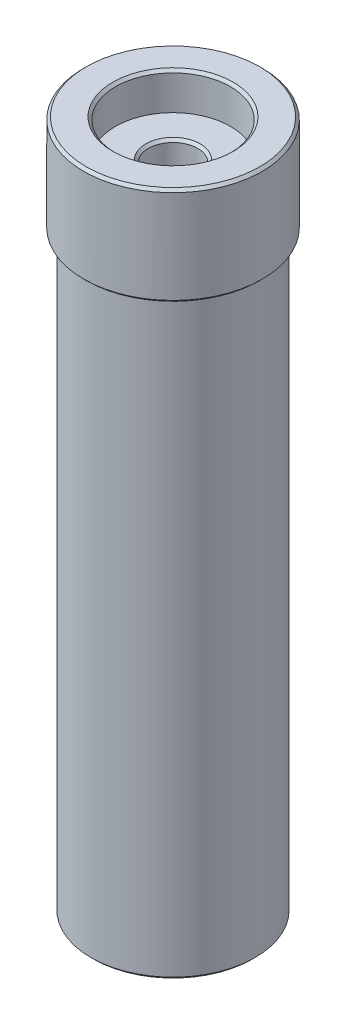
ISO-10303-21;
HEADER;
FILE_DESCRIPTION(('STEP AP214'),'2;1');
FILE_NAME('part.step','',(''),(''),'','','');
FILE_SCHEMA(('AUTOMOTIVE_DESIGN { 1 0 10303 214 1 1 1 1 }'));
ENDSEC;
DATA;
#1=APPLICATION_CONTEXT('core data for automotive mechanical design processes');
#2=APPLICATION_PROTOCOL_DEFINITION('international standard','automotive_design',2000,#1);
#3=PRODUCT_CONTEXT('',#1,'mechanical');
#4=PRODUCT('Part','Part','',(#3));
#5=PRODUCT_RELATED_PRODUCT_CATEGORY('part','',(#4));
#6=PRODUCT_DEFINITION_FORMATION('','',#4);
#7=PRODUCT_DEFINITION_CONTEXT('part definition',#1,'design');
#8=PRODUCT_DEFINITION('design','',#6,#7);
#9=PRODUCT_DEFINITION_SHAPE('','',#8);
#10=(LENGTH_UNIT() NAMED_UNIT(*) SI_UNIT(.MILLI.,.METRE.));
#11=(NAMED_UNIT(*) PLANE_ANGLE_UNIT() SI_UNIT($,.RADIAN.));
#12=(NAMED_UNIT(*) SI_UNIT($,.STERADIAN.) SOLID_ANGLE_UNIT());
#13=UNCERTAINTY_MEASURE_WITH_UNIT(LENGTH_MEASURE(1.E-05),#10,'distance_accuracy_value','');
#14=(GEOMETRIC_REPRESENTATION_CONTEXT(3) GLOBAL_UNCERTAINTY_ASSIGNED_CONTEXT((#13)) GLOBAL_UNIT_ASSIGNED_CONTEXT((#10,
#11,#12)) REPRESENTATION_CONTEXT('',''));
#15=CARTESIAN_POINT('',(0.,0.,0.));
#16=DIRECTION('',(0.,0.,1.));
#17=DIRECTION('',(1.,0.,0.));
#18=AXIS2_PLACEMENT_3D('',#15,#16,#17);
#19=CARTESIAN_POINT('',(0.,126.1872,0.));
#20=DIRECTION('',(0.,1.,0.));
#21=DIRECTION('',(0.,0.,1.));
#22=AXIS2_PLACEMENT_3D('',#19,#20,#21);
#23=CYLINDRICAL_SURFACE('',#22,4.76249999999998);
#24=CARTESIAN_POINT('',(0.,125.6792,0.));
#25=DIRECTION('',(0.,1.,0.));
#26=DIRECTION('',(0.,0.,1.));
#27=AXIS2_PLACEMENT_3D('',#24,#25,#26);
#28=CIRCLE('',#27,4.76249999999998);
#29=CARTESIAN_POINT('',(0.,125.6792,4.76249999999998));
#30=VERTEX_POINT('',#29);
#31=EDGE_CURVE('E70',#30,#30,#28,.T.);
#32=ORIENTED_EDGE('',*,*,#31,.T.);
#33=EDGE_LOOP('',(#32));
#34=FACE_BOUND('',#33,.T.);
#35=CARTESIAN_POINT('',(0.,119.0625,0.));
#36=DIRECTION('',(0.,-1.,0.));
#37=DIRECTION('',(0.,0.,-1.));
#38=AXIS2_PLACEMENT_3D('',#35,#36,#37);
#39=CIRCLE('',#38,4.76249999999998);
#40=CARTESIAN_POINT('',(0.,119.0625,-4.76249999999998));
#41=VERTEX_POINT('',#40);
#42=EDGE_CURVE('E74',#41,#41,#39,.F.);
#43=ORIENTED_EDGE('',*,*,#42,.F.);
#44=EDGE_LOOP('',(#43));
#45=FACE_BOUND('',#44,.T.);
#46=ADVANCED_FACE('F35',(#34,#45),#23,.F.);
#47=CARTESIAN_POINT('',(0.,114.3,0.));
#48=DIRECTION('',(0.,-1.,0.));
#49=DIRECTION('',(0.,0.,-1.));
#50=AXIS2_PLACEMENT_3D('',#47,#48,#49);
#51=CYLINDRICAL_SURFACE('',#50,15.875);
#52=CARTESIAN_POINT('',(0.,0.507999999999981,0.));
#53=DIRECTION('',(0.,1.,0.));
#54=DIRECTION('',(0.,0.,1.));
#55=AXIS2_PLACEMENT_3D('',#52,#53,#54);
#56=CIRCLE('',#55,15.875);
#57=CARTESIAN_POINT('',(0.,0.507999999999981,15.875));
#58=VERTEX_POINT('',#57);
#59=EDGE_CURVE('E55',#58,#58,#56,.T.);
#60=ORIENTED_EDGE('',*,*,#59,.T.);
#61=EDGE_LOOP('',(#60));
#62=FACE_BOUND('',#61,.T.);
#63=CARTESIAN_POINT('',(0.,114.3,0.));
#64=DIRECTION('',(0.,1.,0.));
#65=DIRECTION('',(0.,0.,1.));
#66=AXIS2_PLACEMENT_3D('',#63,#64,#65);
#67=CIRCLE('',#66,15.875);
#68=CARTESIAN_POINT('',(0.,114.3,15.875));
#69=VERTEX_POINT('',#68);
#70=EDGE_CURVE('E73',#69,#69,#67,.T.);
#71=ORIENTED_EDGE('',*,*,#70,.F.);
#72=EDGE_LOOP('',(#71));
#73=FACE_BOUND('',#72,.T.);
#74=ADVANCED_FACE('F121',(#62,#73),#51,.T.);
#75=CARTESIAN_POINT('',(0.,0.,0.));
#76=DIRECTION('',(0.,1.,0.));
#77=DIRECTION('',(0.,0.,1.));
#78=AXIS2_PLACEMENT_3D('',#75,#76,#77);
#79=PLANE('',#78);
#80=CARTESIAN_POINT('',(0.,0.,0.));
#81=DIRECTION('',(0.,1.,0.));
#82=DIRECTION('',(0.,0.,1.));
#83=AXIS2_PLACEMENT_3D('',#80,#81,#82);
#84=CIRCLE('',#83,15.367);
#85=CARTESIAN_POINT('',(0.,0.,15.367));
#86=VERTEX_POINT('',#85);
#87=EDGE_CURVE('E50',#86,#86,#84,.F.);
#88=ORIENTED_EDGE('',*,*,#87,.T.);
#89=EDGE_LOOP('',(#88));
#90=FACE_BOUND('',#89,.T.);
#91=CARTESIAN_POINT('',(0.,0.,0.));
#92=DIRECTION('',(0.,-1.,0.));
#93=DIRECTION('',(0.,0.,-1.));
#94=AXIS2_PLACEMENT_3D('',#91,#92,#93);
#95=CIRCLE('',#94,11.7078125);
#96=CARTESIAN_POINT('',(0.,0.,-11.7078125));
#97=VERTEX_POINT('',#96);
#98=EDGE_CURVE('E77',#97,#97,#95,.T.);
#99=ORIENTED_EDGE('',*,*,#98,.F.);
#100=EDGE_LOOP('',(#99));
#101=FACE_BOUND('',#100,.T.);
#102=ADVANCED_FACE('F127',(#90,#101),#79,.F.);
#103=CARTESIAN_POINT('',(0.,133.35,0.));
#104=DIRECTION('',(0.,-1.,0.));
#105=DIRECTION('',(0.,0.,-1.));
#106=AXIS2_PLACEMENT_3D('',#103,#104,#105);
#107=CYLINDRICAL_SURFACE('',#106,17.272);
#108=CARTESIAN_POINT('',(0.,114.808,0.));
#109=DIRECTION('',(0.,1.,0.));
#110=DIRECTION('',(0.,0.,1.));
#111=AXIS2_PLACEMENT_3D('',#108,#109,#110);
#112=CIRCLE('',#111,17.272);
#113=CARTESIAN_POINT('',(0.,114.808,-17.272));
#114=VERTEX_POINT('',#113);
#115=EDGE_CURVE('E42',#114,#114,#112,.T.);
#116=CARTESIAN_POINT('',(0.,132.842,0.));
#117=DIRECTION('',(0.,1.,0.));
#118=DIRECTION('',(0.,0.,1.));
#119=AXIS2_PLACEMENT_3D('',#116,#117,#118);
#120=CIRCLE('',#119,17.272);
#121=CARTESIAN_POINT('',(0.,132.842,-17.272));
#122=VERTEX_POINT('',#121);
#123=EDGE_CURVE('E46',#122,#122,#120,.F.);
#124=CARTESIAN_POINT('',(0.,114.808,-17.272));
#125=CARTESIAN_POINT('',(0.,114.995854166667,-17.272));
#126=CARTESIAN_POINT('',(0.,115.183708333333,-17.272));
#127=CARTESIAN_POINT('',(0.,115.559416666667,-17.272));
#128=CARTESIAN_POINT('',(0.,115.747270833333,-17.272));
#129=CARTESIAN_POINT('',(0.,116.122979166667,-17.272));
#130=CARTESIAN_POINT('',(0.,116.310833333333,-17.272));
#131=CARTESIAN_POINT('',(0.,116.686541666667,-17.272));
#132=CARTESIAN_POINT('',(0.,116.874395833333,-17.272));
#133=CARTESIAN_POINT('',(0.,117.250104166667,-17.272));
#134=CARTESIAN_POINT('',(0.,117.437958333333,-17.272));
#135=CARTESIAN_POINT('',(0.,117.813666666667,-17.272));
#136=CARTESIAN_POINT('',(0.,118.001520833333,-17.272));
#137=CARTESIAN_POINT('',(0.,118.377229166667,-17.272));
#138=CARTESIAN_POINT('',(0.,118.565083333333,-17.272));
#139=CARTESIAN_POINT('',(0.,118.940791666667,-17.272));
#140=CARTESIAN_POINT('',(0.,119.128645833333,-17.272));
#141=CARTESIAN_POINT('',(0.,119.504354166667,-17.272));
#142=CARTESIAN_POINT('',(0.,119.692208333333,-17.272));
#143=CARTESIAN_POINT('',(0.,120.067916666667,-17.272));
#144=CARTESIAN_POINT('',(0.,120.255770833333,-17.272));
#145=CARTESIAN_POINT('',(0.,120.631479166667,-17.272));
#146=CARTESIAN_POINT('',(0.,120.819333333333,-17.272));
#147=CARTESIAN_POINT('',(0.,121.195041666667,-17.272));
#148=CARTESIAN_POINT('',(0.,121.382895833333,-17.272));
#149=CARTESIAN_POINT('',(0.,121.758604166667,-17.272));
#150=CARTESIAN_POINT('',(0.,121.946458333333,-17.272));
#151=CARTESIAN_POINT('',(0.,122.322166666667,-17.272));
#152=CARTESIAN_POINT('',(0.,122.510020833333,-17.272));
#153=CARTESIAN_POINT('',(0.,122.885729166667,-17.272));
#154=CARTESIAN_POINT('',(0.,123.073583333333,-17.272));
#155=CARTESIAN_POINT('',(0.,123.449291666667,-17.272));
#156=CARTESIAN_POINT('',(0.,123.637145833333,-17.272));
#157=CARTESIAN_POINT('',(0.,124.012854166667,-17.272));
#158=CARTESIAN_POINT('',(0.,124.200708333333,-17.272));
#159=CARTESIAN_POINT('',(0.,124.576416666667,-17.272));
#160=CARTESIAN_POINT('',(0.,124.764270833333,-17.272));
#161=CARTESIAN_POINT('',(0.,125.139979166667,-17.272));
#162=CARTESIAN_POINT('',(0.,125.327833333333,-17.272));
#163=CARTESIAN_POINT('',(0.,125.703541666667,-17.272));
#164=CARTESIAN_POINT('',(0.,125.891395833333,-17.272));
#165=CARTESIAN_POINT('',(0.,126.267104166667,-17.272));
#166=CARTESIAN_POINT('',(0.,126.454958333333,-17.272));
#167=CARTESIAN_POINT('',(0.,126.830666666667,-17.272));
#168=CARTESIAN_POINT('',(0.,127.018520833333,-17.272));
#169=CARTESIAN_POINT('',(0.,127.394229166667,-17.272));
#170=CARTESIAN_POINT('',(0.,127.582083333333,-17.272));
#171=CARTESIAN_POINT('',(0.,127.957791666667,-17.272));
#172=CARTESIAN_POINT('',(0.,128.145645833333,-17.272));
#173=CARTESIAN_POINT('',(0.,128.521354166667,-17.272));
#174=CARTESIAN_POINT('',(0.,128.709208333333,-17.272));
#175=CARTESIAN_POINT('',(0.,129.084916666667,-17.272));
#176=CARTESIAN_POINT('',(0.,129.272770833333,-17.272));
#177=CARTESIAN_POINT('',(0.,129.648479166667,-17.272));
#178=CARTESIAN_POINT('',(0.,129.836333333333,-17.272));
#179=CARTESIAN_POINT('',(0.,130.212041666667,-17.272));
#180=CARTESIAN_POINT('',(0.,130.399895833333,-17.272));
#181=CARTESIAN_POINT('',(0.,130.775604166667,-17.272));
#182=CARTESIAN_POINT('',(0.,130.963458333333,-17.272));
#183=CARTESIAN_POINT('',(0.,131.339166666667,-17.272));
#184=CARTESIAN_POINT('',(0.,131.527020833333,-17.272));
#185=CARTESIAN_POINT('',(0.,131.902729166667,-17.272));
#186=CARTESIAN_POINT('',(0.,132.090583333333,-17.272));
#187=CARTESIAN_POINT('',(0.,132.466291666667,-17.272));
#188=CARTESIAN_POINT('',(0.,132.654145833333,-17.272));
#189=CARTESIAN_POINT('',(0.,132.842,-17.272));
#190=B_SPLINE_CURVE_WITH_KNOTS('',3,(#124,#125,#126,#127,#128,#129,#130,#131,#132,#133,#134,
#135,#136,#137,#138,#139,#140,#141,#142,#143,#144,#145,#146,#147,#148,#149,#150,#151,#152,#153,
#154,#155,#156,#157,#158,#159,#160,#161,#162,#163,#164,#165,#166,#167,#168,#169,#170,#171,#172,
#173,#174,#175,#176,#177,#178,#179,#180,#181,#182,#183,#184,#185,#186,#187,#188,#189),
.UNSPECIFIED.,.F.,.F.,(4,2,2,2,2,2,2,2,2,2,2,2,2,2,2,2,2,2,2,2,2,2,2,2,2,2,2,2,2,2,2,2,4),(0.,
0.563562500000003,1.12712500000001,1.6906875,2.25425,2.8178125,3.38137500000001,3.9449375,
4.5085,5.0720625,5.63562500000001,6.19918749999999,6.76275,7.3263125,7.889875,8.45343749999999,
9.017,9.5805625,10.144125,10.7076875,11.27125,11.8348125,12.398375,12.9619375,13.5255,
14.0890625,14.652625,15.2161875,15.77975,16.3433125,16.906875,17.4704375,18.034),.UNSPECIFIED.);
#191=EDGE_CURVE('BSEAM143',#114,#122,#190,.T.);
#192=ORIENTED_EDGE('',*,*,#115,.T.);
#193=ORIENTED_EDGE('',*,*,#123,.T.);
#194=ORIENTED_EDGE('',*,*,#191,.T.);
#195=ORIENTED_EDGE('',*,*,#191,.F.);
#196=EDGE_LOOP('',(#192,#194,#193,#195));
#197=FACE_BOUND('',#196,.T.);
#198=ADVANCED_FACE('F143',(#197),#107,.T.);
#199=CARTESIAN_POINT('',(0.,133.35,0.));
#200=DIRECTION('',(0.,1.,0.));
#201=DIRECTION('',(0.,0.,1.));
#202=AXIS2_PLACEMENT_3D('',#199,#200,#201);
#203=PLANE('',#202);
#204=CARTESIAN_POINT('',(0.,133.35,0.));
#205=DIRECTION('',(0.,1.,0.));
#206=DIRECTION('',(0.,0.,1.));
#207=AXIS2_PLACEMENT_3D('',#204,#205,#206);
#208=CIRCLE('',#207,11.6205);
#209=CARTESIAN_POINT('',(0.,133.35,11.6205));
#210=VERTEX_POINT('',#209);
#211=EDGE_CURVE('E58',#210,#210,#208,.F.);
#212=ORIENTED_EDGE('',*,*,#211,.T.);
#213=EDGE_LOOP('',(#212));
#214=FACE_BOUND('',#213,.T.);
#215=CARTESIAN_POINT('',(0.,133.35,0.));
#216=DIRECTION('',(0.,1.,0.));
#217=DIRECTION('',(0.,0.,1.));
#218=AXIS2_PLACEMENT_3D('',#215,#216,#217);
#219=CIRCLE('',#218,16.7640000000001);
#220=CARTESIAN_POINT('',(0.,133.35,16.7640000000001));
#221=VERTEX_POINT('',#220);
#222=EDGE_CURVE('E61',#221,#221,#219,.T.);
#223=ORIENTED_EDGE('',*,*,#222,.T.);
#224=EDGE_LOOP('',(#223));
#225=FACE_BOUND('',#224,.T.);
#226=ADVANCED_FACE('F140',(#214,#225),#203,.T.);
#227=CARTESIAN_POINT('',(0.,114.3,0.));
#228=DIRECTION('',(0.,1.,0.));
#229=DIRECTION('',(0.,0.,1.));
#230=AXIS2_PLACEMENT_3D('',#227,#228,#229);
#231=PLANE('',#230);
#232=CARTESIAN_POINT('',(0.,114.3,0.));
#233=DIRECTION('',(0.,1.,0.));
#234=DIRECTION('',(0.,0.,1.));
#235=AXIS2_PLACEMENT_3D('',#232,#233,#234);
#236=CIRCLE('',#235,16.7639999999999);
#237=CARTESIAN_POINT('',(0.,114.3,16.7639999999999));
#238=VERTEX_POINT('',#237);
#239=EDGE_CURVE('E12',#238,#238,#236,.F.);
#240=ORIENTED_EDGE('',*,*,#239,.T.);
#241=EDGE_LOOP('',(#240));
#242=FACE_BOUND('',#241,.T.);
#243=ORIENTED_EDGE('',*,*,#70,.T.);
#244=EDGE_LOOP('',(#243));
#245=FACE_BOUND('',#244,.T.);
#246=ADVANCED_FACE('F138',(#242,#245),#231,.F.);
#247=CARTESIAN_POINT('',(0.,126.1872,0.));
#248=DIRECTION('',(0.,1.,0.));
#249=DIRECTION('',(0.,0.,1.));
#250=AXIS2_PLACEMENT_3D('',#247,#248,#249);
#251=CYLINDRICAL_SURFACE('',#250,11.1125);
#252=CARTESIAN_POINT('',(0.,132.842,0.));
#253=DIRECTION('',(0.,1.,0.));
#254=DIRECTION('',(0.,0.,1.));
#255=AXIS2_PLACEMENT_3D('',#252,#253,#254);
#256=CIRCLE('',#255,11.1125);
#257=CARTESIAN_POINT('',(0.,132.842,11.1125));
#258=VERTEX_POINT('',#257);
#259=EDGE_CURVE('E64',#258,#258,#256,.T.);
#260=ORIENTED_EDGE('',*,*,#259,.T.);
#261=EDGE_LOOP('',(#260));
#262=FACE_BOUND('',#261,.T.);
#263=CARTESIAN_POINT('',(0.,126.1872,0.));
#264=DIRECTION('',(0.,1.,0.));
#265=DIRECTION('',(0.,0.,1.));
#266=AXIS2_PLACEMENT_3D('',#263,#264,#265);
#267=CIRCLE('',#266,11.1125);
#268=CARTESIAN_POINT('',(0.,126.1872,11.1125));
#269=VERTEX_POINT('',#268);
#270=EDGE_CURVE('E81',#269,#269,#267,.T.);
#271=ORIENTED_EDGE('',*,*,#270,.F.);
#272=EDGE_LOOP('',(#271));
#273=FACE_BOUND('',#272,.T.);
#274=ADVANCED_FACE('F134',(#262,#273),#251,.F.);
#275=CARTESIAN_POINT('',(0.,126.1872,0.));
#276=DIRECTION('',(0.,1.,0.));
#277=DIRECTION('',(0.,0.,1.));
#278=AXIS2_PLACEMENT_3D('',#275,#276,#277);
#279=PLANE('',#278);
#280=CARTESIAN_POINT('',(0.,126.1872,0.));
#281=DIRECTION('',(0.,1.,0.));
#282=DIRECTION('',(0.,0.,1.));
#283=AXIS2_PLACEMENT_3D('',#280,#281,#282);
#284=CIRCLE('',#283,5.27049999999994);
#285=CARTESIAN_POINT('',(0.,126.1872,5.27049999999994));
#286=VERTEX_POINT('',#285);
#287=EDGE_CURVE('E67',#286,#286,#284,.F.);
#288=ORIENTED_EDGE('',*,*,#287,.T.);
#289=EDGE_LOOP('',(#288));
#290=FACE_BOUND('',#289,.T.);
#291=ORIENTED_EDGE('',*,*,#270,.T.);
#292=EDGE_LOOP('',(#291));
#293=FACE_BOUND('',#292,.T.);
#294=ADVANCED_FACE('F109',(#290,#293),#279,.T.);
#295=CARTESIAN_POINT('',(0.,111.125,0.));
#296=DIRECTION('',(0.,1.,0.));
#297=DIRECTION('',(0.,0.,1.));
#298=AXIS2_PLACEMENT_3D('',#295,#296,#297);
#299=PLANE('',#298);
#300=CARTESIAN_POINT('',(0.,111.125,0.));
#301=DIRECTION('',(0.,-1.,0.));
#302=DIRECTION('',(0.,0.,-1.));
#303=AXIS2_PLACEMENT_3D('',#300,#301,#302);
#304=CIRCLE('',#303,8.334375);
#305=CARTESIAN_POINT('',(0.,111.125,-8.334375));
#306=VERTEX_POINT('',#305);
#307=EDGE_CURVE('E89',#306,#306,#304,.T.);
#308=ORIENTED_EDGE('',*,*,#307,.F.);
#309=EDGE_LOOP('',(#308));
#310=FACE_BOUND('',#309,.T.);
#311=CARTESIAN_POINT('',(0.,111.125,0.));
#312=DIRECTION('',(0.,1.,0.));
#313=DIRECTION('',(0.,0.,1.));
#314=AXIS2_PLACEMENT_3D('',#311,#312,#313);
#315=CIRCLE('',#314,11.7078125);
#316=CARTESIAN_POINT('',(0.,111.125,11.7078125));
#317=VERTEX_POINT('',#316);
#318=EDGE_CURVE('E84',#317,#317,#315,.F.);
#319=ORIENTED_EDGE('',*,*,#318,.T.);
#320=EDGE_LOOP('',(#319));
#321=FACE_BOUND('',#320,.T.);
#322=ADVANCED_FACE('F105',(#310,#321),#299,.F.);
#323=CARTESIAN_POINT('',(0.,147.414694446442,0.));
#324=DIRECTION('',(0.,-1.,0.));
#325=DIRECTION('',(0.,0.,-1.));
#326=AXIS2_PLACEMENT_3D('',#323,#324,#325);
#327=CYLINDRICAL_SURFACE('',#326,11.7078125);
#328=ORIENTED_EDGE('',*,*,#98,.T.);
#329=EDGE_LOOP('',(#328));
#330=FACE_BOUND('',#329,.T.);
#331=ORIENTED_EDGE('',*,*,#318,.F.);
#332=EDGE_LOOP('',(#331));
#333=FACE_BOUND('',#332,.T.);
#334=ADVANCED_FACE('F108',(#330,#333),#327,.F.);
#335=CARTESIAN_POINT('',(0.,119.0625,0.));
#336=DIRECTION('',(0.,-1.,0.));
#337=DIRECTION('',(0.,0.,-1.));
#338=AXIS2_PLACEMENT_3D('',#335,#336,#337);
#339=PLANE('',#338);
#340=CARTESIAN_POINT('',(0.,119.0625,0.));
#341=DIRECTION('',(0.,-1.,0.));
#342=DIRECTION('',(0.,0.,-1.));
#343=AXIS2_PLACEMENT_3D('',#340,#341,#342);
#344=CIRCLE('',#343,8.334375);
#345=CARTESIAN_POINT('',(0.,119.0625,-8.334375));
#346=VERTEX_POINT('',#345);
#347=EDGE_CURVE('E78',#346,#346,#344,.T.);
#348=ORIENTED_EDGE('',*,*,#347,.T.);
#349=EDGE_LOOP('',(#348));
#350=FACE_BOUND('',#349,.T.);
#351=ORIENTED_EDGE('',*,*,#42,.T.);
#352=EDGE_LOOP('',(#351));
#353=FACE_BOUND('',#352,.T.);
#354=ADVANCED_FACE('F95',(#350,#353),#339,.T.);
#355=CARTESIAN_POINT('',(0.,119.0625,0.));
#356=DIRECTION('',(0.,-1.,0.));
#357=DIRECTION('',(0.,0.,-1.));
#358=AXIS2_PLACEMENT_3D('',#355,#356,#357);
#359=CYLINDRICAL_SURFACE('',#358,8.334375);
#360=ORIENTED_EDGE('',*,*,#347,.F.);
#361=EDGE_LOOP('',(#360));
#362=FACE_BOUND('',#361,.T.);
#363=ORIENTED_EDGE('',*,*,#307,.T.);
#364=EDGE_LOOP('',(#363));
#365=FACE_BOUND('',#364,.T.);
#366=ADVANCED_FACE('F98',(#362,#365),#359,.F.);
#367=CARTESIAN_POINT('',(0.,125.6792,0.));
#368=DIRECTION('',(0.,1.,0.));
#369=DIRECTION('',(0.,0.,1.));
#370=AXIS2_PLACEMENT_3D('',#367,#368,#369);
#371=CONICAL_SURFACE('',#370,4.76249999999998,0.785398163397461);
#372=ORIENTED_EDGE('',*,*,#287,.F.);
#373=EDGE_LOOP('',(#372));
#374=FACE_BOUND('',#373,.T.);
#375=ORIENTED_EDGE('',*,*,#31,.F.);
#376=EDGE_LOOP('',(#375));
#377=FACE_BOUND('',#376,.T.);
#378=ADVANCED_FACE('F101',(#374,#377),#371,.F.);
#379=CARTESIAN_POINT('',(0.,132.842,0.));
#380=DIRECTION('',(0.,1.,0.));
#381=DIRECTION('',(0.,0.,1.));
#382=AXIS2_PLACEMENT_3D('',#379,#380,#381);
#383=CONICAL_SURFACE('',#382,11.1125,0.785398163397418);
#384=ORIENTED_EDGE('',*,*,#211,.F.);
#385=EDGE_LOOP('',(#384));
#386=FACE_BOUND('',#385,.T.);
#387=ORIENTED_EDGE('',*,*,#259,.F.);
#388=EDGE_LOOP('',(#387));
#389=FACE_BOUND('',#388,.T.);
#390=ADVANCED_FACE('F154',(#386,#389),#383,.F.);
#391=CARTESIAN_POINT('',(0.,0.507999999999981,0.));
#392=DIRECTION('',(0.,1.,0.));
#393=DIRECTION('',(0.,0.,1.));
#394=AXIS2_PLACEMENT_3D('',#391,#392,#393);
#395=CONICAL_SURFACE('',#394,15.875,0.785398163397462);
#396=ORIENTED_EDGE('',*,*,#87,.F.);
#397=EDGE_LOOP('',(#396));
#398=FACE_BOUND('',#397,.T.);
#399=ORIENTED_EDGE('',*,*,#59,.F.);
#400=EDGE_LOOP('',(#399));
#401=FACE_BOUND('',#400,.T.);
#402=ADVANCED_FACE('F158',(#398,#401),#395,.T.);
#403=CARTESIAN_POINT('',(0.,114.808,0.));
#404=DIRECTION('',(0.,1.,0.));
#405=DIRECTION('',(0.,0.,1.));
#406=AXIS2_PLACEMENT_3D('',#403,#404,#405);
#407=CONICAL_SURFACE('',#406,17.272,0.785398163397438);
#408=ORIENTED_EDGE('',*,*,#239,.F.);
#409=EDGE_LOOP('',(#408));
#410=FACE_BOUND('',#409,.T.);
#411=ORIENTED_EDGE('',*,*,#115,.F.);
#412=EDGE_LOOP('',(#411));
#413=FACE_BOUND('',#412,.T.);
#414=ADVANCED_FACE('F161',(#410,#413),#407,.T.);
#415=CARTESIAN_POINT('',(0.,133.35,0.));
#416=DIRECTION('',(0.,-1.,0.));
#417=DIRECTION('',(0.,0.,-1.));
#418=AXIS2_PLACEMENT_3D('',#415,#416,#417);
#419=CONICAL_SURFACE('',#418,16.7640000000001,0.785398163397462);
#420=ORIENTED_EDGE('',*,*,#123,.F.);
#421=EDGE_LOOP('',(#420));
#422=FACE_BOUND('',#421,.T.);
#423=ORIENTED_EDGE('',*,*,#222,.F.);
#424=EDGE_LOOP('',(#423));
#425=FACE_BOUND('',#424,.T.);
#426=ADVANCED_FACE('F37',(#422,#425),#419,.T.);
#427=CLOSED_SHELL('',(#46,#74,#102,#198,#226,#246,#274,#294,#322,#334,#354,#366,#378,#390,#402,
#414,#426));
#428=MANIFOLD_SOLID_BREP('B2',#427);
#429=ADVANCED_BREP_SHAPE_REPRESENTATION('',(#18,#428),#14);
#430=SHAPE_DEFINITION_REPRESENTATION(#9,#429);
ENDSEC;
END-ISO-10303-21;
